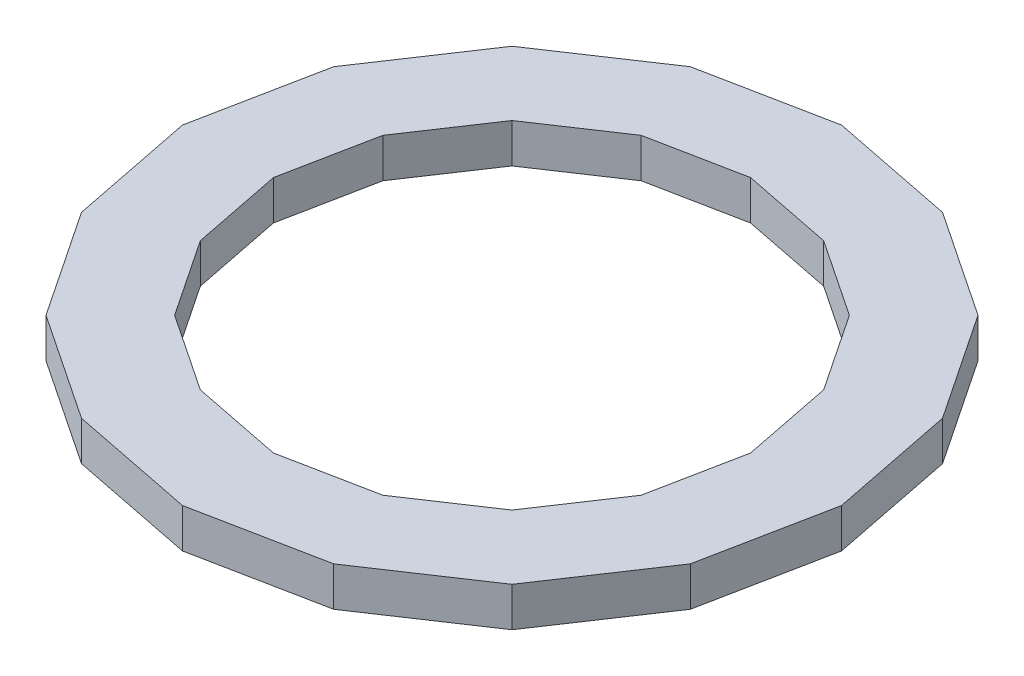
ISO-10303-21;
HEADER;
FILE_DESCRIPTION(('STEP AP214'),'2;1');
FILE_NAME('part.step','',(''),(''),'','','');
FILE_SCHEMA(('AUTOMOTIVE_DESIGN { 1 0 10303 214 1 1 1 1 }'));
ENDSEC;
DATA;
#1=APPLICATION_CONTEXT('core data for automotive mechanical design processes');
#2=APPLICATION_PROTOCOL_DEFINITION('international standard','automotive_design',2000,#1);
#3=PRODUCT_CONTEXT('',#1,'mechanical');
#4=PRODUCT('Part','Part','',(#3));
#5=PRODUCT_RELATED_PRODUCT_CATEGORY('part','',(#4));
#6=PRODUCT_DEFINITION_FORMATION('','',#4);
#7=PRODUCT_DEFINITION_CONTEXT('part definition',#1,'design');
#8=PRODUCT_DEFINITION('design','',#6,#7);
#9=PRODUCT_DEFINITION_SHAPE('','',#8);
#10=(LENGTH_UNIT() NAMED_UNIT(*) SI_UNIT(.MILLI.,.METRE.));
#11=(NAMED_UNIT(*) PLANE_ANGLE_UNIT() SI_UNIT($,.RADIAN.));
#12=(NAMED_UNIT(*) SI_UNIT($,.STERADIAN.) SOLID_ANGLE_UNIT());
#13=UNCERTAINTY_MEASURE_WITH_UNIT(LENGTH_MEASURE(1.E-05),#10,'distance_accuracy_value','');
#14=(GEOMETRIC_REPRESENTATION_CONTEXT(3) GLOBAL_UNCERTAINTY_ASSIGNED_CONTEXT((#13)) GLOBAL_UNIT_ASSIGNED_CONTEXT((#10,
#11,#12)) REPRESENTATION_CONTEXT('',''));
#15=CARTESIAN_POINT('',(0.,0.,0.));
#16=DIRECTION('',(0.,0.,1.));
#17=DIRECTION('',(1.,0.,0.));
#18=AXIS2_PLACEMENT_3D('',#15,#16,#17);
#19=CARTESIAN_POINT('',(0.,19.05,0.));
#20=DIRECTION('',(0.,1.,0.));
#21=DIRECTION('',(0.,0.,1.));
#22=AXIS2_PLACEMENT_3D('',#19,#20,#21);
#23=PLANE('',#22);
#24=DIRECTION('',(0.195090322016117,0.,-0.980785280403233));
#25=VECTOR('',#24,1.);
#26=CARTESIAN_POINT('',(147.349757573891,19.05,61.0342679994913));
#27=LINE('',#26,#25);
#28=CARTESIAN_POINT('',(147.349757573891,19.05,61.0342679994913));
#29=VERTEX_POINT('',#28);
#30=CARTESIAN_POINT('',(159.490228312954,19.05,-1.84921265718118E-12));
#31=VERTEX_POINT('',#30);
#32=EDGE_CURVE('E378',#29,#31,#27,.T.);
#33=ORIENTED_EDGE('',*,*,#32,.T.);
#34=DIRECTION('',(-0.195090322016139,0.,-0.980785280403228));
#35=VECTOR('',#34,1.);
#36=CARTESIAN_POINT('',(159.490228312954,19.05,-1.84921265718118E-12));
#37=LINE('',#36,#35);
#38=CARTESIAN_POINT('',(147.349757573889,19.05,-61.0342679994947));
#39=VERTEX_POINT('',#38);
#40=EDGE_CURVE('E381',#31,#39,#37,.T.);
#41=ORIENTED_EDGE('',*,*,#40,.T.);
#42=DIRECTION('',(-0.555570233019612,0.,-0.831469612302539));
#43=VECTOR('',#42,1.);
#44=CARTESIAN_POINT('',(147.349757573889,19.05,-61.0342679994947));
#45=LINE('',#44,#43);
#46=CARTESIAN_POINT('',(112.776621973079,19.05,-112.776621973082));
#47=VERTEX_POINT('',#46);
#48=EDGE_CURVE('E384',#39,#47,#45,.T.);
#49=ORIENTED_EDGE('',*,*,#48,.T.);
#50=DIRECTION('',(-0.831469612302552,0.,-0.555570233019592));
#51=VECTOR('',#50,1.);
#52=CARTESIAN_POINT('',(112.776621973079,19.05,-112.776621973082));
#53=LINE('',#52,#51);
#54=CARTESIAN_POINT('',(61.0342679994915,19.05,-147.349757573891));
#55=VERTEX_POINT('',#54);
#56=EDGE_CURVE('E386',#47,#55,#53,.T.);
#57=ORIENTED_EDGE('',*,*,#56,.T.);
#58=DIRECTION('',(-0.980785280403233,0.,-0.195090322016117));
#59=VECTOR('',#58,1.);
#60=CARTESIAN_POINT('',(61.0342679994915,19.05,-147.349757573891));
#61=LINE('',#60,#59);
#62=CARTESIAN_POINT('',(-1.93094145436864E-12,19.05,-159.490228312954));
#63=VERTEX_POINT('',#62);
#64=EDGE_CURVE('E388',#55,#63,#61,.T.);
#65=ORIENTED_EDGE('',*,*,#64,.T.);
#66=DIRECTION('',(-0.980785280403228,0.,0.19509032201614));
#67=VECTOR('',#66,1.);
#68=CARTESIAN_POINT('',(-1.93094145436864E-12,19.05,-159.490228312954));
#69=LINE('',#68,#67);
#70=CARTESIAN_POINT('',(-61.0342679994947,19.05,-147.349757573889));
#71=VERTEX_POINT('',#70);
#72=EDGE_CURVE('E390',#63,#71,#69,.T.);
#73=ORIENTED_EDGE('',*,*,#72,.T.);
#74=DIRECTION('',(-0.831469612302539,0.,0.555570233019612));
#75=VECTOR('',#74,1.);
#76=CARTESIAN_POINT('',(-61.0342679994947,19.05,-147.349757573889));
#77=LINE('',#76,#75);
#78=CARTESIAN_POINT('',(-112.776621973082,19.05,-112.776621973079));
#79=VERTEX_POINT('',#78);
#80=EDGE_CURVE('E392',#71,#79,#77,.T.);
#81=ORIENTED_EDGE('',*,*,#80,.T.);
#82=DIRECTION('',(-0.555570233019593,0.,0.831469612302552));
#83=VECTOR('',#82,1.);
#84=CARTESIAN_POINT('',(-112.776621973082,19.05,-112.776621973079));
#85=LINE('',#84,#83);
#86=CARTESIAN_POINT('',(-147.349757573891,19.05,-61.0342679994913));
#87=VERTEX_POINT('',#86);
#88=EDGE_CURVE('E394',#79,#87,#85,.T.);
#89=ORIENTED_EDGE('',*,*,#88,.T.);
#90=DIRECTION('',(-0.195090322016117,0.,0.980785280403233));
#91=VECTOR('',#90,1.);
#92=CARTESIAN_POINT('',(-147.349757573891,19.05,-61.0342679994913));
#93=LINE('',#92,#91);
#94=CARTESIAN_POINT('',(-159.490228312954,19.05,1.84609156139237E-12));
#95=VERTEX_POINT('',#94);
#96=EDGE_CURVE('E397',#87,#95,#93,.T.);
#97=ORIENTED_EDGE('',*,*,#96,.T.);
#98=DIRECTION('',(0.195090322016139,0.,0.980785280403228));
#99=VECTOR('',#98,1.);
#100=CARTESIAN_POINT('',(-159.490228312954,19.05,1.84609156139237E-12));
#101=LINE('',#100,#99);
#102=CARTESIAN_POINT('',(-147.349757573889,19.05,61.0342679994947));
#103=VERTEX_POINT('',#102);
#104=EDGE_CURVE('E399',#95,#103,#101,.T.);
#105=ORIENTED_EDGE('',*,*,#104,.T.);
#106=DIRECTION('',(0.555570233019612,0.,0.831469612302539));
#107=VECTOR('',#106,1.);
#108=CARTESIAN_POINT('',(-147.349757573889,19.05,61.0342679994947));
#109=LINE('',#108,#107);
#110=CARTESIAN_POINT('',(-112.776621973079,19.05,112.776621973082));
#111=VERTEX_POINT('',#110);
#112=EDGE_CURVE('E401',#103,#111,#109,.T.);
#113=ORIENTED_EDGE('',*,*,#112,.T.);
#114=DIRECTION('',(0.831469612302551,0.,0.555570233019593));
#115=VECTOR('',#114,1.);
#116=CARTESIAN_POINT('',(-112.776621973079,19.05,112.776621973082));
#117=LINE('',#116,#115);
#118=CARTESIAN_POINT('',(-61.0342679994913,19.05,147.349757573891));
#119=VERTEX_POINT('',#118);
#120=EDGE_CURVE('E404',#111,#119,#117,.T.);
#121=ORIENTED_EDGE('',*,*,#120,.T.);
#122=DIRECTION('',(0.980785280403233,0.,0.195090322016117));
#123=VECTOR('',#122,1.);
#124=CARTESIAN_POINT('',(-61.0342679994913,19.05,147.349757573891));
#125=LINE('',#124,#123);
#126=CARTESIAN_POINT('',(1.78007314182968E-12,19.05,159.490228312954));
#127=VERTEX_POINT('',#126);
#128=EDGE_CURVE('E407',#119,#127,#125,.T.);
#129=ORIENTED_EDGE('',*,*,#128,.T.);
#130=DIRECTION('',(0.980785280403228,0.,-0.195090322016139));
#131=VECTOR('',#130,1.);
#132=CARTESIAN_POINT('',(1.78007314182968E-12,19.05,159.490228312954));
#133=LINE('',#132,#131);
#134=CARTESIAN_POINT('',(61.0342679994947,19.05,147.349757573889));
#135=VERTEX_POINT('',#134);
#136=EDGE_CURVE('E409',#127,#135,#133,.T.);
#137=ORIENTED_EDGE('',*,*,#136,.T.);
#138=DIRECTION('',(0.831469612302539,0.,-0.555570233019612));
#139=VECTOR('',#138,1.);
#140=CARTESIAN_POINT('',(61.0342679994947,19.05,147.349757573889));
#141=LINE('',#140,#139);
#142=CARTESIAN_POINT('',(112.776621973082,19.05,112.776621973079));
#143=VERTEX_POINT('',#142);
#144=EDGE_CURVE('E412',#135,#143,#141,.T.);
#145=ORIENTED_EDGE('',*,*,#144,.T.);
#146=DIRECTION('',(0.555570233019593,0.,-0.831469612302552));
#147=VECTOR('',#146,1.);
#148=CARTESIAN_POINT('',(112.776621973082,19.05,112.776621973079));
#149=LINE('',#148,#147);
#150=EDGE_CURVE('E415',#143,#29,#149,.T.);
#151=ORIENTED_EDGE('',*,*,#150,.T.);
#152=EDGE_LOOP('',(#33,#41,#49,#57,#65,#73,#81,#89,#97,#105,#113,#121,#129,#137,#145,#151));
#153=FACE_BOUND('',#152,.T.);
#154=DIRECTION('',(-0.19509032201614,0.,-0.980785280403228));
#155=VECTOR('',#154,1.);
#156=CARTESIAN_POINT('',(115.464282101519,19.05,-1.37402825448511E-12));
#157=LINE('',#156,#155);
#158=CARTESIAN_POINT('',(115.464282101519,19.05,-1.37402825448511E-12));
#159=VERTEX_POINT('',#158);
#160=CARTESIAN_POINT('',(106.675086969702,19.05,-44.1862677901814));
#161=VERTEX_POINT('',#160);
#162=EDGE_CURVE('E252',#159,#161,#157,.T.);
#163=ORIENTED_EDGE('',*,*,#162,.F.);
#164=DIRECTION('',(0.195090322016117,0.,-0.980785280403233));
#165=VECTOR('',#164,1.);
#166=CARTESIAN_POINT('',(106.675086969703,19.05,44.1862677901788));
#167=LINE('',#166,#165);
#168=CARTESIAN_POINT('',(106.675086969703,19.05,44.1862677901788));
#169=VERTEX_POINT('',#168);
#170=EDGE_CURVE('E243',#169,#159,#167,.T.);
#171=ORIENTED_EDGE('',*,*,#170,.F.);
#172=DIRECTION('',(0.555570233019592,0.,-0.831469612302552));
#173=VECTOR('',#172,1.);
#174=CARTESIAN_POINT('',(81.6455768588213,19.05,81.6455768588193));
#175=LINE('',#174,#173);
#176=CARTESIAN_POINT('',(81.6455768588213,19.05,81.6455768588193));
#177=VERTEX_POINT('',#176);
#178=EDGE_CURVE('E296',#177,#169,#175,.T.);
#179=ORIENTED_EDGE('',*,*,#178,.F.);
#180=DIRECTION('',(0.831469612302538,0.,-0.555570233019612));
#181=VECTOR('',#180,1.);
#182=CARTESIAN_POINT('',(44.1862677901814,19.05,106.675086969702));
#183=LINE('',#182,#181);
#184=CARTESIAN_POINT('',(44.1862677901814,19.05,106.675086969702));
#185=VERTEX_POINT('',#184);
#186=EDGE_CURVE('E294',#185,#177,#183,.T.);
#187=ORIENTED_EDGE('',*,*,#186,.F.);
#188=DIRECTION('',(0.980785280403228,0.,-0.19509032201614));
#189=VECTOR('',#188,1.);
#190=CARTESIAN_POINT('',(1.33926693915157E-12,19.05,115.464282101519));
#191=LINE('',#190,#189);
#192=CARTESIAN_POINT('',(1.33926693915157E-12,19.05,115.464282101519));
#193=VERTEX_POINT('',#192);
#194=EDGE_CURVE('E292',#193,#185,#191,.T.);
#195=ORIENTED_EDGE('',*,*,#194,.F.);
#196=DIRECTION('',(0.980785280403233,0.,0.195090322016116));
#197=VECTOR('',#196,1.);
#198=CARTESIAN_POINT('',(-44.1862677901788,19.05,106.675086969703));
#199=LINE('',#198,#197);
#200=CARTESIAN_POINT('',(-44.1862677901788,19.05,106.675086969703));
#201=VERTEX_POINT('',#200);
#202=EDGE_CURVE('E290',#201,#193,#199,.T.);
#203=ORIENTED_EDGE('',*,*,#202,.F.);
#204=DIRECTION('',(0.831469612302552,0.,0.555570233019592));
#205=VECTOR('',#204,1.);
#206=CARTESIAN_POINT('',(-81.6455768588193,19.05,81.6455768588213));
#207=LINE('',#206,#205);
#208=CARTESIAN_POINT('',(-81.6455768588193,19.05,81.6455768588213));
#209=VERTEX_POINT('',#208);
#210=EDGE_CURVE('E288',#209,#201,#207,.T.);
#211=ORIENTED_EDGE('',*,*,#210,.F.);
#212=DIRECTION('',(0.555570233019612,0.,0.831469612302539));
#213=VECTOR('',#212,1.);
#214=CARTESIAN_POINT('',(-106.675086969702,19.05,44.1862677901815));
#215=LINE('',#214,#213);
#216=CARTESIAN_POINT('',(-106.675086969702,19.05,44.1862677901815));
#217=VERTEX_POINT('',#216);
#218=EDGE_CURVE('E285',#217,#209,#215,.T.);
#219=ORIENTED_EDGE('',*,*,#218,.F.);
#220=DIRECTION('',(0.19509032201614,0.,0.980785280403228));
#221=VECTOR('',#220,1.);
#222=CARTESIAN_POINT('',(-115.464282101519,19.05,1.38800018994925E-12));
#223=LINE('',#222,#221);
#224=CARTESIAN_POINT('',(-115.464282101519,19.05,1.38800018994925E-12));
#225=VERTEX_POINT('',#224);
#226=EDGE_CURVE('E283',#225,#217,#223,.T.);
#227=ORIENTED_EDGE('',*,*,#226,.F.);
#228=DIRECTION('',(-0.195090322016117,0.,0.980785280403233));
#229=VECTOR('',#228,1.);
#230=CARTESIAN_POINT('',(-106.675086969703,19.05,-44.1862677901788));
#231=LINE('',#230,#229);
#232=CARTESIAN_POINT('',(-106.675086969703,19.05,-44.1862677901788));
#233=VERTEX_POINT('',#232);
#234=EDGE_CURVE('E280',#233,#225,#231,.T.);
#235=ORIENTED_EDGE('',*,*,#234,.F.);
#236=DIRECTION('',(-0.555570233019592,0.,0.831469612302552));
#237=VECTOR('',#236,1.);
#238=CARTESIAN_POINT('',(-81.6455768588213,19.05,-81.6455768588193));
#239=LINE('',#238,#237);
#240=CARTESIAN_POINT('',(-81.6455768588213,19.05,-81.6455768588193));
#241=VERTEX_POINT('',#240);
#242=EDGE_CURVE('E277',#241,#233,#239,.T.);
#243=ORIENTED_EDGE('',*,*,#242,.F.);
#244=DIRECTION('',(-0.831469612302539,0.,0.555570233019612));
#245=VECTOR('',#244,1.);
#246=CARTESIAN_POINT('',(-44.1862677901814,19.05,-106.675086969702));
#247=LINE('',#246,#245);
#248=CARTESIAN_POINT('',(-44.1862677901814,19.05,-106.675086969702));
#249=VERTEX_POINT('',#248);
#250=EDGE_CURVE('E275',#249,#241,#247,.T.);
#251=ORIENTED_EDGE('',*,*,#250,.F.);
#252=DIRECTION('',(-0.980785280403228,0.,0.19509032201614));
#253=VECTOR('',#252,1.);
#254=CARTESIAN_POINT('',(-1.4291549179459E-12,19.05,-115.464282101519));
#255=LINE('',#254,#253);
#256=CARTESIAN_POINT('',(-1.4291549179459E-12,19.05,-115.464282101519));
#257=VERTEX_POINT('',#256);
#258=EDGE_CURVE('E273',#257,#249,#255,.T.);
#259=ORIENTED_EDGE('',*,*,#258,.F.);
#260=DIRECTION('',(-0.980785280403233,0.,-0.195090322016116));
#261=VECTOR('',#260,1.);
#262=CARTESIAN_POINT('',(44.1862677901789,19.05,-106.675086969703));
#263=LINE('',#262,#261);
#264=CARTESIAN_POINT('',(44.1862677901789,19.05,-106.675086969703));
#265=VERTEX_POINT('',#264);
#266=EDGE_CURVE('E271',#265,#257,#263,.T.);
#267=ORIENTED_EDGE('',*,*,#266,.F.);
#268=DIRECTION('',(-0.831469612302552,0.,-0.555570233019592));
#269=VECTOR('',#268,1.);
#270=CARTESIAN_POINT('',(81.6455768588193,19.05,-81.6455768588213));
#271=LINE('',#270,#269);
#272=CARTESIAN_POINT('',(81.6455768588193,19.05,-81.6455768588213));
#273=VERTEX_POINT('',#272);
#274=EDGE_CURVE('E267',#273,#265,#271,.T.);
#275=ORIENTED_EDGE('',*,*,#274,.F.);
#276=DIRECTION('',(-0.555570233019612,0.,-0.831469612302538));
#277=VECTOR('',#276,1.);
#278=CARTESIAN_POINT('',(106.675086969702,19.05,-44.1862677901814));
#279=LINE('',#278,#277);
#280=EDGE_CURVE('E265',#161,#273,#279,.T.);
#281=ORIENTED_EDGE('',*,*,#280,.F.);
#282=EDGE_LOOP('',(#163,#171,#179,#187,#195,#203,#211,#219,#227,#235,#243,#251,#259,#267,#275,#281));
#283=FACE_BOUND('',#282,.T.);
#284=ADVANCED_FACE('F34',(#153,#283),#23,.T.);
#285=CARTESIAN_POINT('',(0.,0.,0.));
#286=DIRECTION('',(0.,1.,0.));
#287=DIRECTION('',(0.,0.,1.));
#288=AXIS2_PLACEMENT_3D('',#285,#286,#287);
#289=PLANE('',#288);
#290=DIRECTION('',(0.195090322016117,0.,-0.980785280403233));
#291=VECTOR('',#290,1.);
#292=CARTESIAN_POINT('',(147.349757573891,0.,61.0342679994913));
#293=LINE('',#292,#291);
#294=CARTESIAN_POINT('',(147.349757573891,0.,61.0342679994913));
#295=VERTEX_POINT('',#294);
#296=CARTESIAN_POINT('',(159.490228312954,0.,-1.84921265718118E-12));
#297=VERTEX_POINT('',#296);
#298=EDGE_CURVE('E260',#295,#297,#293,.T.);
#299=ORIENTED_EDGE('',*,*,#298,.F.);
#300=DIRECTION('',(0.555570233019593,0.,-0.831469612302552));
#301=VECTOR('',#300,1.);
#302=CARTESIAN_POINT('',(112.776621973082,0.,112.776621973079));
#303=LINE('',#302,#301);
#304=CARTESIAN_POINT('',(112.776621973082,0.,112.776621973079));
#305=VERTEX_POINT('',#304);
#306=EDGE_CURVE('E382',#305,#295,#303,.T.);
#307=ORIENTED_EDGE('',*,*,#306,.F.);
#308=DIRECTION('',(0.831469612302539,0.,-0.555570233019612));
#309=VECTOR('',#308,1.);
#310=CARTESIAN_POINT('',(61.0342679994947,0.,147.349757573889));
#311=LINE('',#310,#309);
#312=CARTESIAN_POINT('',(61.0342679994947,0.,147.349757573889));
#313=VERTEX_POINT('',#312);
#314=EDGE_CURVE('E450',#313,#305,#311,.T.);
#315=ORIENTED_EDGE('',*,*,#314,.F.);
#316=DIRECTION('',(0.980785280403228,0.,-0.195090322016139));
#317=VECTOR('',#316,1.);
#318=CARTESIAN_POINT('',(1.78007314182968E-12,0.,159.490228312954));
#319=LINE('',#318,#317);
#320=CARTESIAN_POINT('',(1.78007314182968E-12,0.,159.490228312954));
#321=VERTEX_POINT('',#320);
#322=EDGE_CURVE('E447',#321,#313,#319,.T.);
#323=ORIENTED_EDGE('',*,*,#322,.F.);
#324=DIRECTION('',(0.980785280403233,0.,0.195090322016117));
#325=VECTOR('',#324,1.);
#326=CARTESIAN_POINT('',(-61.0342679994913,0.,147.349757573891));
#327=LINE('',#326,#325);
#328=CARTESIAN_POINT('',(-61.0342679994913,0.,147.349757573891));
#329=VERTEX_POINT('',#328);
#330=EDGE_CURVE('E444',#329,#321,#327,.T.);
#331=ORIENTED_EDGE('',*,*,#330,.F.);
#332=DIRECTION('',(0.831469612302551,0.,0.555570233019593));
#333=VECTOR('',#332,1.);
#334=CARTESIAN_POINT('',(-112.776621973079,0.,112.776621973082));
#335=LINE('',#334,#333);
#336=CARTESIAN_POINT('',(-112.776621973079,0.,112.776621973082));
#337=VERTEX_POINT('',#336);
#338=EDGE_CURVE('E441',#337,#329,#335,.T.);
#339=ORIENTED_EDGE('',*,*,#338,.F.);
#340=DIRECTION('',(0.555570233019612,0.,0.831469612302539));
#341=VECTOR('',#340,1.);
#342=CARTESIAN_POINT('',(-147.349757573889,0.,61.0342679994947));
#343=LINE('',#342,#341);
#344=CARTESIAN_POINT('',(-147.349757573889,0.,61.0342679994947));
#345=VERTEX_POINT('',#344);
#346=EDGE_CURVE('E439',#345,#337,#343,.T.);
#347=ORIENTED_EDGE('',*,*,#346,.F.);
#348=DIRECTION('',(0.195090322016139,0.,0.980785280403228));
#349=VECTOR('',#348,1.);
#350=CARTESIAN_POINT('',(-159.490228312954,0.,1.84609156139237E-12));
#351=LINE('',#350,#349);
#352=CARTESIAN_POINT('',(-159.490228312954,0.,1.84609156139237E-12));
#353=VERTEX_POINT('',#352);
#354=EDGE_CURVE('E436',#353,#345,#351,.T.);
#355=ORIENTED_EDGE('',*,*,#354,.F.);
#356=DIRECTION('',(-0.195090322016117,0.,0.980785280403233));
#357=VECTOR('',#356,1.);
#358=CARTESIAN_POINT('',(-147.349757573891,0.,-61.0342679994913));
#359=LINE('',#358,#357);
#360=CARTESIAN_POINT('',(-147.349757573891,0.,-61.0342679994913));
#361=VERTEX_POINT('',#360);
#362=EDGE_CURVE('E434',#361,#353,#359,.T.);
#363=ORIENTED_EDGE('',*,*,#362,.F.);
#364=DIRECTION('',(-0.555570233019593,0.,0.831469612302552));
#365=VECTOR('',#364,1.);
#366=CARTESIAN_POINT('',(-112.776621973082,0.,-112.776621973079));
#367=LINE('',#366,#365);
#368=CARTESIAN_POINT('',(-112.776621973082,0.,-112.776621973079));
#369=VERTEX_POINT('',#368);
#370=EDGE_CURVE('E432',#369,#361,#367,.T.);
#371=ORIENTED_EDGE('',*,*,#370,.F.);
#372=DIRECTION('',(-0.831469612302539,0.,0.555570233019612));
#373=VECTOR('',#372,1.);
#374=CARTESIAN_POINT('',(-61.0342679994947,0.,-147.349757573889));
#375=LINE('',#374,#373);
#376=CARTESIAN_POINT('',(-61.0342679994947,0.,-147.349757573889));
#377=VERTEX_POINT('',#376);
#378=EDGE_CURVE('E430',#377,#369,#375,.T.);
#379=ORIENTED_EDGE('',*,*,#378,.F.);
#380=DIRECTION('',(-0.980785280403228,0.,0.19509032201614));
#381=VECTOR('',#380,1.);
#382=CARTESIAN_POINT('',(-1.93094145436864E-12,0.,-159.490228312954));
#383=LINE('',#382,#381);
#384=CARTESIAN_POINT('',(-1.93094145436864E-12,0.,-159.490228312954));
#385=VERTEX_POINT('',#384);
#386=EDGE_CURVE('E428',#385,#377,#383,.T.);
#387=ORIENTED_EDGE('',*,*,#386,.F.);
#388=DIRECTION('',(-0.980785280403233,0.,-0.195090322016117));
#389=VECTOR('',#388,1.);
#390=CARTESIAN_POINT('',(61.0342679994915,0.,-147.349757573891));
#391=LINE('',#390,#389);
#392=CARTESIAN_POINT('',(61.0342679994915,0.,-147.349757573891));
#393=VERTEX_POINT('',#392);
#394=EDGE_CURVE('E426',#393,#385,#391,.T.);
#395=ORIENTED_EDGE('',*,*,#394,.F.);
#396=DIRECTION('',(-0.831469612302552,0.,-0.555570233019592));
#397=VECTOR('',#396,1.);
#398=CARTESIAN_POINT('',(112.776621973079,0.,-112.776621973082));
#399=LINE('',#398,#397);
#400=CARTESIAN_POINT('',(112.776621973079,0.,-112.776621973082));
#401=VERTEX_POINT('',#400);
#402=EDGE_CURVE('E424',#401,#393,#399,.T.);
#403=ORIENTED_EDGE('',*,*,#402,.F.);
#404=DIRECTION('',(-0.555570233019612,0.,-0.831469612302539));
#405=VECTOR('',#404,1.);
#406=CARTESIAN_POINT('',(147.349757573889,0.,-61.0342679994947));
#407=LINE('',#406,#405);
#408=CARTESIAN_POINT('',(147.349757573889,0.,-61.0342679994947));
#409=VERTEX_POINT('',#408);
#410=EDGE_CURVE('E422',#409,#401,#407,.T.);
#411=ORIENTED_EDGE('',*,*,#410,.F.);
#412=DIRECTION('',(-0.195090322016139,0.,-0.980785280403228));
#413=VECTOR('',#412,1.);
#414=CARTESIAN_POINT('',(159.490228312954,0.,-1.84921265718118E-12));
#415=LINE('',#414,#413);
#416=EDGE_CURVE('E420',#297,#409,#415,.T.);
#417=ORIENTED_EDGE('',*,*,#416,.F.);
#418=EDGE_LOOP('',(#299,#307,#315,#323,#331,#339,#347,#355,#363,#371,#379,#387,#395,#403,#411,#417));
#419=FACE_BOUND('',#418,.T.);
#420=DIRECTION('',(0.195090322016117,0.,-0.980785280403233));
#421=VECTOR('',#420,1.);
#422=CARTESIAN_POINT('',(106.675086969703,0.,44.1862677901788));
#423=LINE('',#422,#421);
#424=CARTESIAN_POINT('',(106.675086969703,0.,44.1862677901788));
#425=VERTEX_POINT('',#424);
#426=CARTESIAN_POINT('',(115.464282101519,0.,-1.37402825448511E-12));
#427=VERTEX_POINT('',#426);
#428=EDGE_CURVE('E57',#425,#427,#423,.T.);
#429=ORIENTED_EDGE('',*,*,#428,.T.);
#430=DIRECTION('',(-0.19509032201614,0.,-0.980785280403228));
#431=VECTOR('',#430,1.);
#432=CARTESIAN_POINT('',(115.464282101519,0.,-1.37402825448511E-12));
#433=LINE('',#432,#431);
#434=CARTESIAN_POINT('',(106.675086969702,0.,-44.1862677901814));
#435=VERTEX_POINT('',#434);
#436=EDGE_CURVE('E259',#427,#435,#433,.T.);
#437=ORIENTED_EDGE('',*,*,#436,.T.);
#438=DIRECTION('',(-0.555570233019612,0.,-0.831469612302538));
#439=VECTOR('',#438,1.);
#440=CARTESIAN_POINT('',(106.675086969702,0.,-44.1862677901814));
#441=LINE('',#440,#439);
#442=CARTESIAN_POINT('',(81.6455768588193,0.,-81.6455768588213));
#443=VERTEX_POINT('',#442);
#444=EDGE_CURVE('E300',#435,#443,#441,.T.);
#445=ORIENTED_EDGE('',*,*,#444,.T.);
#446=DIRECTION('',(-0.831469612302552,0.,-0.555570233019592));
#447=VECTOR('',#446,1.);
#448=CARTESIAN_POINT('',(81.6455768588193,0.,-81.6455768588213));
#449=LINE('',#448,#447);
#450=CARTESIAN_POINT('',(44.1862677901789,0.,-106.675086969703));
#451=VERTEX_POINT('',#450);
#452=EDGE_CURVE('E303',#443,#451,#449,.T.);
#453=ORIENTED_EDGE('',*,*,#452,.T.);
#454=DIRECTION('',(-0.980785280403233,0.,-0.195090322016116));
#455=VECTOR('',#454,1.);
#456=CARTESIAN_POINT('',(44.1862677901789,0.,-106.675086969703));
#457=LINE('',#456,#455);
#458=CARTESIAN_POINT('',(-1.4291549179459E-12,0.,-115.464282101519));
#459=VERTEX_POINT('',#458);
#460=EDGE_CURVE('E306',#451,#459,#457,.T.);
#461=ORIENTED_EDGE('',*,*,#460,.T.);
#462=DIRECTION('',(-0.980785280403228,0.,0.19509032201614));
#463=VECTOR('',#462,1.);
#464=CARTESIAN_POINT('',(-1.4291549179459E-12,0.,-115.464282101519));
#465=LINE('',#464,#463);
#466=CARTESIAN_POINT('',(-44.1862677901814,0.,-106.675086969702));
#467=VERTEX_POINT('',#466);
#468=EDGE_CURVE('E310',#459,#467,#465,.T.);
#469=ORIENTED_EDGE('',*,*,#468,.T.);
#470=DIRECTION('',(-0.831469612302539,0.,0.555570233019612));
#471=VECTOR('',#470,1.);
#472=CARTESIAN_POINT('',(-44.1862677901814,0.,-106.675086969702));
#473=LINE('',#472,#471);
#474=CARTESIAN_POINT('',(-81.6455768588213,0.,-81.6455768588193));
#475=VERTEX_POINT('',#474);
#476=EDGE_CURVE('E313',#467,#475,#473,.T.);
#477=ORIENTED_EDGE('',*,*,#476,.T.);
#478=DIRECTION('',(-0.555570233019592,0.,0.831469612302552));
#479=VECTOR('',#478,1.);
#480=CARTESIAN_POINT('',(-81.6455768588213,0.,-81.6455768588193));
#481=LINE('',#480,#479);
#482=CARTESIAN_POINT('',(-106.675086969703,0.,-44.1862677901788));
#483=VERTEX_POINT('',#482);
#484=EDGE_CURVE('E317',#475,#483,#481,.T.);
#485=ORIENTED_EDGE('',*,*,#484,.T.);
#486=DIRECTION('',(-0.195090322016117,0.,0.980785280403233));
#487=VECTOR('',#486,1.);
#488=CARTESIAN_POINT('',(-106.675086969703,0.,-44.1862677901788));
#489=LINE('',#488,#487);
#490=CARTESIAN_POINT('',(-115.464282101519,0.,1.38800018994925E-12));
#491=VERTEX_POINT('',#490);
#492=EDGE_CURVE('E320',#483,#491,#489,.T.);
#493=ORIENTED_EDGE('',*,*,#492,.T.);
#494=DIRECTION('',(0.19509032201614,0.,0.980785280403228));
#495=VECTOR('',#494,1.);
#496=CARTESIAN_POINT('',(-115.464282101519,0.,1.38800018994925E-12));
#497=LINE('',#496,#495);
#498=CARTESIAN_POINT('',(-106.675086969702,0.,44.1862677901815));
#499=VERTEX_POINT('',#498);
#500=EDGE_CURVE('E324',#491,#499,#497,.T.);
#501=ORIENTED_EDGE('',*,*,#500,.T.);
#502=DIRECTION('',(0.555570233019612,0.,0.831469612302539));
#503=VECTOR('',#502,1.);
#504=CARTESIAN_POINT('',(-106.675086969702,0.,44.1862677901815));
#505=LINE('',#504,#503);
#506=CARTESIAN_POINT('',(-81.6455768588193,0.,81.6455768588213));
#507=VERTEX_POINT('',#506);
#508=EDGE_CURVE('E327',#499,#507,#505,.T.);
#509=ORIENTED_EDGE('',*,*,#508,.T.);
#510=DIRECTION('',(0.831469612302552,0.,0.555570233019592));
#511=VECTOR('',#510,1.);
#512=CARTESIAN_POINT('',(-81.6455768588193,0.,81.6455768588213));
#513=LINE('',#512,#511);
#514=CARTESIAN_POINT('',(-44.1862677901788,0.,106.675086969703));
#515=VERTEX_POINT('',#514);
#516=EDGE_CURVE('E330',#507,#515,#513,.T.);
#517=ORIENTED_EDGE('',*,*,#516,.T.);
#518=DIRECTION('',(0.980785280403233,0.,0.195090322016116));
#519=VECTOR('',#518,1.);
#520=CARTESIAN_POINT('',(-44.1862677901788,0.,106.675086969703));
#521=LINE('',#520,#519);
#522=CARTESIAN_POINT('',(1.33926693915157E-12,0.,115.464282101519));
#523=VERTEX_POINT('',#522);
#524=EDGE_CURVE('E334',#515,#523,#521,.T.);
#525=ORIENTED_EDGE('',*,*,#524,.T.);
#526=DIRECTION('',(0.980785280403228,0.,-0.19509032201614));
#527=VECTOR('',#526,1.);
#528=CARTESIAN_POINT('',(1.33926693915157E-12,0.,115.464282101519));
#529=LINE('',#528,#527);
#530=CARTESIAN_POINT('',(44.1862677901814,0.,106.675086969702));
#531=VERTEX_POINT('',#530);
#532=EDGE_CURVE('E337',#523,#531,#529,.T.);
#533=ORIENTED_EDGE('',*,*,#532,.T.);
#534=DIRECTION('',(0.831469612302538,0.,-0.555570233019612));
#535=VECTOR('',#534,1.);
#536=CARTESIAN_POINT('',(44.1862677901814,0.,106.675086969702));
#537=LINE('',#536,#535);
#538=CARTESIAN_POINT('',(81.6455768588213,0.,81.6455768588193));
#539=VERTEX_POINT('',#538);
#540=EDGE_CURVE('E341',#531,#539,#537,.T.);
#541=ORIENTED_EDGE('',*,*,#540,.T.);
#542=DIRECTION('',(0.555570233019592,0.,-0.831469612302552));
#543=VECTOR('',#542,1.);
#544=CARTESIAN_POINT('',(81.6455768588213,0.,81.6455768588193));
#545=LINE('',#544,#543);
#546=EDGE_CURVE('E253',#539,#425,#545,.T.);
#547=ORIENTED_EDGE('',*,*,#546,.T.);
#548=EDGE_LOOP('',(#429,#437,#445,#453,#461,#469,#477,#485,#493,#501,#509,#517,#525,#533,#541,#547));
#549=FACE_BOUND('',#548,.T.);
#550=ADVANCED_FACE('F509',(#419,#549),#289,.F.);
#551=CARTESIAN_POINT('',(147.349757573891,19.05,61.0342679994913));
#552=DIRECTION('',(-0.980785280403233,0.,-0.195090322016117));
#553=DIRECTION('',(-0.195090322016117,0.,0.980785280403233));
#554=AXIS2_PLACEMENT_3D('',#551,#552,#553);
#555=PLANE('',#554);
#556=ORIENTED_EDGE('',*,*,#298,.T.);
#557=DIRECTION('',(0.,-1.,0.));
#558=VECTOR('',#557,1.);
#559=CARTESIAN_POINT('',(159.490228312954,19.05,-1.84921265718118E-12));
#560=LINE('',#559,#558);
#561=EDGE_CURVE('E11',#31,#297,#560,.T.);
#562=ORIENTED_EDGE('',*,*,#561,.F.);
#563=ORIENTED_EDGE('',*,*,#32,.F.);
#564=DIRECTION('',(0.,-1.,0.));
#565=VECTOR('',#564,1.);
#566=CARTESIAN_POINT('',(147.349757573891,19.05,61.0342679994913));
#567=LINE('',#566,#565);
#568=EDGE_CURVE('E417',#29,#295,#567,.T.);
#569=ORIENTED_EDGE('',*,*,#568,.T.);
#570=EDGE_LOOP('',(#556,#562,#563,#569));
#571=FACE_BOUND('',#570,.T.);
#572=ADVANCED_FACE('F36',(#571),#555,.F.);
#573=CARTESIAN_POINT('',(159.490228312954,19.05,-1.84921265718118E-12));
#574=DIRECTION('',(-0.980785280403228,0.,0.195090322016139));
#575=DIRECTION('',(0.195090322016139,0.,0.980785280403228));
#576=AXIS2_PLACEMENT_3D('',#573,#574,#575);
#577=PLANE('',#576);
#578=ORIENTED_EDGE('',*,*,#416,.T.);
#579=DIRECTION('',(0.,-1.,0.));
#580=VECTOR('',#579,1.);
#581=CARTESIAN_POINT('',(147.349757573889,19.05,-61.0342679994947));
#582=LINE('',#581,#580);
#583=EDGE_CURVE('E42',#39,#409,#582,.T.);
#584=ORIENTED_EDGE('',*,*,#583,.F.);
#585=ORIENTED_EDGE('',*,*,#40,.F.);
#586=ORIENTED_EDGE('',*,*,#561,.T.);
#587=EDGE_LOOP('',(#578,#584,#585,#586));
#588=FACE_BOUND('',#587,.T.);
#589=ADVANCED_FACE('F526',(#588),#577,.F.);
#590=CARTESIAN_POINT('',(147.349757573889,19.05,-61.0342679994947));
#591=DIRECTION('',(-0.831469612302539,0.,0.555570233019612));
#592=DIRECTION('',(0.555570233019612,0.,0.831469612302539));
#593=AXIS2_PLACEMENT_3D('',#590,#591,#592);
#594=PLANE('',#593);
#595=ORIENTED_EDGE('',*,*,#410,.T.);
#596=DIRECTION('',(0.,-1.,0.));
#597=VECTOR('',#596,1.);
#598=CARTESIAN_POINT('',(112.776621973079,19.05,-112.776621973082));
#599=LINE('',#598,#597);
#600=EDGE_CURVE('E496',#47,#401,#599,.T.);
#601=ORIENTED_EDGE('',*,*,#600,.F.);
#602=ORIENTED_EDGE('',*,*,#48,.F.);
#603=ORIENTED_EDGE('',*,*,#583,.T.);
#604=EDGE_LOOP('',(#595,#601,#602,#603));
#605=FACE_BOUND('',#604,.T.);
#606=ADVANCED_FACE('F503',(#605),#594,.F.);
#607=CARTESIAN_POINT('',(112.776621973079,19.05,-112.776621973082));
#608=DIRECTION('',(-0.555570233019593,0.,0.831469612302552));
#609=DIRECTION('',(0.831469612302552,0.,0.555570233019593));
#610=AXIS2_PLACEMENT_3D('',#607,#608,#609);
#611=PLANE('',#610);
#612=ORIENTED_EDGE('',*,*,#402,.T.);
#613=DIRECTION('',(0.,-1.,0.));
#614=VECTOR('',#613,1.);
#615=CARTESIAN_POINT('',(61.0342679994915,19.05,-147.349757573891));
#616=LINE('',#615,#614);
#617=EDGE_CURVE('E492',#55,#393,#616,.T.);
#618=ORIENTED_EDGE('',*,*,#617,.F.);
#619=ORIENTED_EDGE('',*,*,#56,.F.);
#620=ORIENTED_EDGE('',*,*,#600,.T.);
#621=EDGE_LOOP('',(#612,#618,#619,#620));
#622=FACE_BOUND('',#621,.T.);
#623=ADVANCED_FACE('F515',(#622),#611,.F.);
#624=CARTESIAN_POINT('',(61.0342679994915,19.05,-147.349757573891));
#625=DIRECTION('',(-0.195090322016117,0.,0.980785280403233));
#626=DIRECTION('',(0.980785280403233,0.,0.195090322016117));
#627=AXIS2_PLACEMENT_3D('',#624,#625,#626);
#628=PLANE('',#627);
#629=ORIENTED_EDGE('',*,*,#394,.T.);
#630=DIRECTION('',(0.,-1.,0.));
#631=VECTOR('',#630,1.);
#632=CARTESIAN_POINT('',(-1.93094145436864E-12,19.05,-159.490228312954));
#633=LINE('',#632,#631);
#634=EDGE_CURVE('E488',#63,#385,#633,.T.);
#635=ORIENTED_EDGE('',*,*,#634,.F.);
#636=ORIENTED_EDGE('',*,*,#64,.F.);
#637=ORIENTED_EDGE('',*,*,#617,.T.);
#638=EDGE_LOOP('',(#629,#635,#636,#637));
#639=FACE_BOUND('',#638,.T.);
#640=ADVANCED_FACE('F519',(#639),#628,.F.);
#641=CARTESIAN_POINT('',(-1.93094145436864E-12,19.05,-159.490228312954));
#642=DIRECTION('',(0.19509032201614,0.,0.980785280403228));
#643=DIRECTION('',(0.980785280403228,0.,-0.19509032201614));
#644=AXIS2_PLACEMENT_3D('',#641,#642,#643);
#645=PLANE('',#644);
#646=ORIENTED_EDGE('',*,*,#386,.T.);
#647=DIRECTION('',(0.,-1.,0.));
#648=VECTOR('',#647,1.);
#649=CARTESIAN_POINT('',(-61.0342679994947,19.05,-147.349757573889));
#650=LINE('',#649,#648);
#651=EDGE_CURVE('E485',#71,#377,#650,.T.);
#652=ORIENTED_EDGE('',*,*,#651,.F.);
#653=ORIENTED_EDGE('',*,*,#72,.F.);
#654=ORIENTED_EDGE('',*,*,#634,.T.);
#655=EDGE_LOOP('',(#646,#652,#653,#654));
#656=FACE_BOUND('',#655,.T.);
#657=ADVANCED_FACE('F579',(#656),#645,.F.);
#658=CARTESIAN_POINT('',(-61.0342679994947,19.05,-147.349757573889));
#659=DIRECTION('',(0.555570233019612,0.,0.831469612302539));
#660=DIRECTION('',(0.831469612302539,0.,-0.555570233019612));
#661=AXIS2_PLACEMENT_3D('',#658,#659,#660);
#662=PLANE('',#661);
#663=ORIENTED_EDGE('',*,*,#378,.T.);
#664=DIRECTION('',(0.,-1.,0.));
#665=VECTOR('',#664,1.);
#666=CARTESIAN_POINT('',(-112.776621973082,19.05,-112.776621973079));
#667=LINE('',#666,#665);
#668=EDGE_CURVE('E481',#79,#369,#667,.T.);
#669=ORIENTED_EDGE('',*,*,#668,.F.);
#670=ORIENTED_EDGE('',*,*,#80,.F.);
#671=ORIENTED_EDGE('',*,*,#651,.T.);
#672=EDGE_LOOP('',(#663,#669,#670,#671));
#673=FACE_BOUND('',#672,.T.);
#674=ADVANCED_FACE('F576',(#673),#662,.F.);
#675=CARTESIAN_POINT('',(-112.776621973082,19.05,-112.776621973079));
#676=DIRECTION('',(0.831469612302552,0.,0.555570233019593));
#677=DIRECTION('',(0.555570233019593,0.,-0.831469612302552));
#678=AXIS2_PLACEMENT_3D('',#675,#676,#677);
#679=PLANE('',#678);
#680=ORIENTED_EDGE('',*,*,#370,.T.);
#681=DIRECTION('',(0.,-1.,0.));
#682=VECTOR('',#681,1.);
#683=CARTESIAN_POINT('',(-147.349757573891,19.05,-61.0342679994913));
#684=LINE('',#683,#682);
#685=EDGE_CURVE('E478',#87,#361,#684,.T.);
#686=ORIENTED_EDGE('',*,*,#685,.F.);
#687=ORIENTED_EDGE('',*,*,#88,.F.);
#688=ORIENTED_EDGE('',*,*,#668,.T.);
#689=EDGE_LOOP('',(#680,#686,#687,#688));
#690=FACE_BOUND('',#689,.T.);
#691=ADVANCED_FACE('F572',(#690),#679,.F.);
#692=CARTESIAN_POINT('',(-147.349757573891,19.05,-61.0342679994913));
#693=DIRECTION('',(0.980785280403233,0.,0.195090322016117));
#694=DIRECTION('',(0.195090322016117,0.,-0.980785280403233));
#695=AXIS2_PLACEMENT_3D('',#692,#693,#694);
#696=PLANE('',#695);
#697=ORIENTED_EDGE('',*,*,#362,.T.);
#698=DIRECTION('',(0.,-1.,0.));
#699=VECTOR('',#698,1.);
#700=CARTESIAN_POINT('',(-159.490228312954,19.05,1.84609156139237E-12));
#701=LINE('',#700,#699);
#702=EDGE_CURVE('E475',#95,#353,#701,.T.);
#703=ORIENTED_EDGE('',*,*,#702,.F.);
#704=ORIENTED_EDGE('',*,*,#96,.F.);
#705=ORIENTED_EDGE('',*,*,#685,.T.);
#706=EDGE_LOOP('',(#697,#703,#704,#705));
#707=FACE_BOUND('',#706,.T.);
#708=ADVANCED_FACE('F568',(#707),#696,.F.);
#709=CARTESIAN_POINT('',(-159.490228312954,19.05,1.84609156139237E-12));
#710=DIRECTION('',(0.980785280403228,0.,-0.195090322016139));
#711=DIRECTION('',(-0.195090322016139,0.,-0.980785280403228));
#712=AXIS2_PLACEMENT_3D('',#709,#710,#711);
#713=PLANE('',#712);
#714=ORIENTED_EDGE('',*,*,#354,.T.);
#715=DIRECTION('',(0.,-1.,0.));
#716=VECTOR('',#715,1.);
#717=CARTESIAN_POINT('',(-147.349757573889,19.05,61.0342679994947));
#718=LINE('',#717,#716);
#719=EDGE_CURVE('E471',#103,#345,#718,.T.);
#720=ORIENTED_EDGE('',*,*,#719,.F.);
#721=ORIENTED_EDGE('',*,*,#104,.F.);
#722=ORIENTED_EDGE('',*,*,#702,.T.);
#723=EDGE_LOOP('',(#714,#720,#721,#722));
#724=FACE_BOUND('',#723,.T.);
#725=ADVANCED_FACE('F563',(#724),#713,.F.);
#726=CARTESIAN_POINT('',(-147.349757573889,19.05,61.0342679994947));
#727=DIRECTION('',(0.831469612302539,0.,-0.555570233019612));
#728=DIRECTION('',(-0.555570233019612,0.,-0.831469612302539));
#729=AXIS2_PLACEMENT_3D('',#726,#727,#728);
#730=PLANE('',#729);
#731=ORIENTED_EDGE('',*,*,#346,.T.);
#732=DIRECTION('',(0.,-1.,0.));
#733=VECTOR('',#732,1.);
#734=CARTESIAN_POINT('',(-112.776621973079,19.05,112.776621973082));
#735=LINE('',#734,#733);
#736=EDGE_CURVE('E468',#111,#337,#735,.T.);
#737=ORIENTED_EDGE('',*,*,#736,.F.);
#738=ORIENTED_EDGE('',*,*,#112,.F.);
#739=ORIENTED_EDGE('',*,*,#719,.T.);
#740=EDGE_LOOP('',(#731,#737,#738,#739));
#741=FACE_BOUND('',#740,.T.);
#742=ADVANCED_FACE('F557',(#741),#730,.F.);
#743=CARTESIAN_POINT('',(-112.776621973079,19.05,112.776621973082));
#744=DIRECTION('',(0.555570233019593,0.,-0.831469612302551));
#745=DIRECTION('',(-0.831469612302551,0.,-0.555570233019593));
#746=AXIS2_PLACEMENT_3D('',#743,#744,#745);
#747=PLANE('',#746);
#748=ORIENTED_EDGE('',*,*,#338,.T.);
#749=DIRECTION('',(0.,-1.,0.));
#750=VECTOR('',#749,1.);
#751=CARTESIAN_POINT('',(-61.0342679994913,19.05,147.349757573891));
#752=LINE('',#751,#750);
#753=EDGE_CURVE('E465',#119,#329,#752,.T.);
#754=ORIENTED_EDGE('',*,*,#753,.F.);
#755=ORIENTED_EDGE('',*,*,#120,.F.);
#756=ORIENTED_EDGE('',*,*,#736,.T.);
#757=EDGE_LOOP('',(#748,#754,#755,#756));
#758=FACE_BOUND('',#757,.T.);
#759=ADVANCED_FACE('F553',(#758),#747,.F.);
#760=CARTESIAN_POINT('',(-61.0342679994913,19.05,147.349757573891));
#761=DIRECTION('',(0.195090322016117,0.,-0.980785280403233));
#762=DIRECTION('',(-0.980785280403233,0.,-0.195090322016117));
#763=AXIS2_PLACEMENT_3D('',#760,#761,#762);
#764=PLANE('',#763);
#765=ORIENTED_EDGE('',*,*,#330,.T.);
#766=DIRECTION('',(0.,-1.,0.));
#767=VECTOR('',#766,1.);
#768=CARTESIAN_POINT('',(1.78007314182968E-12,19.05,159.490228312954));
#769=LINE('',#768,#767);
#770=EDGE_CURVE('E461',#127,#321,#769,.T.);
#771=ORIENTED_EDGE('',*,*,#770,.F.);
#772=ORIENTED_EDGE('',*,*,#128,.F.);
#773=ORIENTED_EDGE('',*,*,#753,.T.);
#774=EDGE_LOOP('',(#765,#771,#772,#773));
#775=FACE_BOUND('',#774,.T.);
#776=ADVANCED_FACE('F548',(#775),#764,.F.);
#777=CARTESIAN_POINT('',(1.78007314182968E-12,19.05,159.490228312954));
#778=DIRECTION('',(-0.195090322016139,0.,-0.980785280403228));
#779=DIRECTION('',(-0.980785280403228,0.,0.195090322016139));
#780=AXIS2_PLACEMENT_3D('',#777,#778,#779);
#781=PLANE('',#780);
#782=ORIENTED_EDGE('',*,*,#322,.T.);
#783=DIRECTION('',(0.,-1.,0.));
#784=VECTOR('',#783,1.);
#785=CARTESIAN_POINT('',(61.0342679994947,19.05,147.349757573889));
#786=LINE('',#785,#784);
#787=EDGE_CURVE('E458',#135,#313,#786,.T.);
#788=ORIENTED_EDGE('',*,*,#787,.F.);
#789=ORIENTED_EDGE('',*,*,#136,.F.);
#790=ORIENTED_EDGE('',*,*,#770,.T.);
#791=EDGE_LOOP('',(#782,#788,#789,#790));
#792=FACE_BOUND('',#791,.T.);
#793=ADVANCED_FACE('F542',(#792),#781,.F.);
#794=CARTESIAN_POINT('',(61.0342679994947,19.05,147.349757573889));
#795=DIRECTION('',(-0.555570233019612,0.,-0.831469612302539));
#796=DIRECTION('',(-0.831469612302539,0.,0.555570233019612));
#797=AXIS2_PLACEMENT_3D('',#794,#795,#796);
#798=PLANE('',#797);
#799=ORIENTED_EDGE('',*,*,#314,.T.);
#800=DIRECTION('',(0.,-1.,0.));
#801=VECTOR('',#800,1.);
#802=CARTESIAN_POINT('',(112.776621973082,19.05,112.776621973079));
#803=LINE('',#802,#801);
#804=EDGE_CURVE('E455',#143,#305,#803,.T.);
#805=ORIENTED_EDGE('',*,*,#804,.F.);
#806=ORIENTED_EDGE('',*,*,#144,.F.);
#807=ORIENTED_EDGE('',*,*,#787,.T.);
#808=EDGE_LOOP('',(#799,#805,#806,#807));
#809=FACE_BOUND('',#808,.T.);
#810=ADVANCED_FACE('F538',(#809),#798,.F.);
#811=CARTESIAN_POINT('',(112.776621973082,19.05,112.776621973079));
#812=DIRECTION('',(-0.831469612302552,0.,-0.555570233019593));
#813=DIRECTION('',(-0.555570233019593,0.,0.831469612302552));
#814=AXIS2_PLACEMENT_3D('',#811,#812,#813);
#815=PLANE('',#814);
#816=ORIENTED_EDGE('',*,*,#306,.T.);
#817=ORIENTED_EDGE('',*,*,#568,.F.);
#818=ORIENTED_EDGE('',*,*,#150,.F.);
#819=ORIENTED_EDGE('',*,*,#804,.T.);
#820=EDGE_LOOP('',(#816,#817,#818,#819));
#821=FACE_BOUND('',#820,.T.);
#822=ADVANCED_FACE('F533',(#821),#815,.F.);
#823=CARTESIAN_POINT('',(106.675086969703,19.05,44.1862677901788));
#824=DIRECTION('',(-0.980785280403233,0.,-0.195090322016117));
#825=DIRECTION('',(-0.195090322016117,0.,0.980785280403233));
#826=AXIS2_PLACEMENT_3D('',#823,#824,#825);
#827=PLANE('',#826);
#828=ORIENTED_EDGE('',*,*,#428,.F.);
#829=DIRECTION('',(0.,-1.,0.));
#830=VECTOR('',#829,1.);
#831=CARTESIAN_POINT('',(106.675086969703,19.05,44.1862677901788));
#832=LINE('',#831,#830);
#833=EDGE_CURVE('E247',#169,#425,#832,.T.);
#834=ORIENTED_EDGE('',*,*,#833,.F.);
#835=ORIENTED_EDGE('',*,*,#170,.T.);
#836=DIRECTION('',(0.,-1.,0.));
#837=VECTOR('',#836,1.);
#838=CARTESIAN_POINT('',(115.464282101519,19.05,-1.37402825448511E-12));
#839=LINE('',#838,#837);
#840=EDGE_CURVE('E246',#159,#427,#839,.T.);
#841=ORIENTED_EDGE('',*,*,#840,.T.);
#842=EDGE_LOOP('',(#828,#834,#835,#841));
#843=FACE_BOUND('',#842,.T.);
#844=ADVANCED_FACE('F245',(#843),#827,.T.);
#845=CARTESIAN_POINT('',(115.464282101519,19.05,-1.37402825448511E-12));
#846=DIRECTION('',(-0.980785280403228,0.,0.19509032201614));
#847=DIRECTION('',(0.19509032201614,0.,0.980785280403228));
#848=AXIS2_PLACEMENT_3D('',#845,#846,#847);
#849=PLANE('',#848);
#850=ORIENTED_EDGE('',*,*,#436,.F.);
#851=ORIENTED_EDGE('',*,*,#840,.F.);
#852=ORIENTED_EDGE('',*,*,#162,.T.);
#853=DIRECTION('',(0.,-1.,0.));
#854=VECTOR('',#853,1.);
#855=CARTESIAN_POINT('',(106.675086969702,19.05,-44.1862677901814));
#856=LINE('',#855,#854);
#857=EDGE_CURVE('E261',#161,#435,#856,.T.);
#858=ORIENTED_EDGE('',*,*,#857,.T.);
#859=EDGE_LOOP('',(#850,#851,#852,#858));
#860=FACE_BOUND('',#859,.T.);
#861=ADVANCED_FACE('F256',(#860),#849,.T.);
#862=CARTESIAN_POINT('',(106.675086969702,19.05,-44.1862677901814));
#863=DIRECTION('',(-0.831469612302539,0.,0.555570233019612));
#864=DIRECTION('',(0.555570233019612,0.,0.831469612302539));
#865=AXIS2_PLACEMENT_3D('',#862,#863,#864);
#866=PLANE('',#865);
#867=ORIENTED_EDGE('',*,*,#444,.F.);
#868=ORIENTED_EDGE('',*,*,#857,.F.);
#869=ORIENTED_EDGE('',*,*,#280,.T.);
#870=DIRECTION('',(0.,-1.,0.));
#871=VECTOR('',#870,1.);
#872=CARTESIAN_POINT('',(81.6455768588193,19.05,-81.6455768588213));
#873=LINE('',#872,#871);
#874=EDGE_CURVE('E375',#273,#443,#873,.T.);
#875=ORIENTED_EDGE('',*,*,#874,.T.);
#876=EDGE_LOOP('',(#867,#868,#869,#875));
#877=FACE_BOUND('',#876,.T.);
#878=ADVANCED_FACE('F661',(#877),#866,.T.);
#879=CARTESIAN_POINT('',(81.6455768588193,19.05,-81.6455768588213));
#880=DIRECTION('',(-0.555570233019592,0.,0.831469612302552));
#881=DIRECTION('',(0.831469612302552,0.,0.555570233019592));
#882=AXIS2_PLACEMENT_3D('',#879,#880,#881);
#883=PLANE('',#882);
#884=ORIENTED_EDGE('',*,*,#452,.F.);
#885=ORIENTED_EDGE('',*,*,#874,.F.);
#886=ORIENTED_EDGE('',*,*,#274,.T.);
#887=DIRECTION('',(0.,-1.,0.));
#888=VECTOR('',#887,1.);
#889=CARTESIAN_POINT('',(44.1862677901789,19.05,-106.675086969703));
#890=LINE('',#889,#888);
#891=EDGE_CURVE('E373',#265,#451,#890,.T.);
#892=ORIENTED_EDGE('',*,*,#891,.T.);
#893=EDGE_LOOP('',(#884,#885,#886,#892));
#894=FACE_BOUND('',#893,.T.);
#895=ADVANCED_FACE('F667',(#894),#883,.T.);
#896=CARTESIAN_POINT('',(44.1862677901789,19.05,-106.675086969703));
#897=DIRECTION('',(-0.195090322016116,0.,0.980785280403233));
#898=DIRECTION('',(0.980785280403233,0.,0.195090322016116));
#899=AXIS2_PLACEMENT_3D('',#896,#897,#898);
#900=PLANE('',#899);
#901=ORIENTED_EDGE('',*,*,#460,.F.);
#902=ORIENTED_EDGE('',*,*,#891,.F.);
#903=ORIENTED_EDGE('',*,*,#266,.T.);
#904=DIRECTION('',(0.,-1.,0.));
#905=VECTOR('',#904,1.);
#906=CARTESIAN_POINT('',(-1.4291549179459E-12,19.05,-115.464282101519));
#907=LINE('',#906,#905);
#908=EDGE_CURVE('E370',#257,#459,#907,.T.);
#909=ORIENTED_EDGE('',*,*,#908,.T.);
#910=EDGE_LOOP('',(#901,#902,#903,#909));
#911=FACE_BOUND('',#910,.T.);
#912=ADVANCED_FACE('F675',(#911),#900,.T.);
#913=CARTESIAN_POINT('',(-1.4291549179459E-12,19.05,-115.464282101519));
#914=DIRECTION('',(0.19509032201614,0.,0.980785280403228));
#915=DIRECTION('',(0.980785280403228,0.,-0.19509032201614));
#916=AXIS2_PLACEMENT_3D('',#913,#914,#915);
#917=PLANE('',#916);
#918=ORIENTED_EDGE('',*,*,#468,.F.);
#919=ORIENTED_EDGE('',*,*,#908,.F.);
#920=ORIENTED_EDGE('',*,*,#258,.T.);
#921=DIRECTION('',(0.,-1.,0.));
#922=VECTOR('',#921,1.);
#923=CARTESIAN_POINT('',(-44.1862677901814,19.05,-106.675086969702));
#924=LINE('',#923,#922);
#925=EDGE_CURVE('E368',#249,#467,#924,.T.);
#926=ORIENTED_EDGE('',*,*,#925,.T.);
#927=EDGE_LOOP('',(#918,#919,#920,#926));
#928=FACE_BOUND('',#927,.T.);
#929=ADVANCED_FACE('F683',(#928),#917,.T.);
#930=CARTESIAN_POINT('',(-44.1862677901814,19.05,-106.675086969702));
#931=DIRECTION('',(0.555570233019612,0.,0.831469612302539));
#932=DIRECTION('',(0.831469612302539,0.,-0.555570233019612));
#933=AXIS2_PLACEMENT_3D('',#930,#931,#932);
#934=PLANE('',#933);
#935=ORIENTED_EDGE('',*,*,#476,.F.);
#936=ORIENTED_EDGE('',*,*,#925,.F.);
#937=ORIENTED_EDGE('',*,*,#250,.T.);
#938=DIRECTION('',(0.,-1.,0.));
#939=VECTOR('',#938,1.);
#940=CARTESIAN_POINT('',(-81.6455768588213,19.05,-81.6455768588193));
#941=LINE('',#940,#939);
#942=EDGE_CURVE('E365',#241,#475,#941,.T.);
#943=ORIENTED_EDGE('',*,*,#942,.T.);
#944=EDGE_LOOP('',(#935,#936,#937,#943));
#945=FACE_BOUND('',#944,.T.);
#946=ADVANCED_FACE('F691',(#945),#934,.T.);
#947=CARTESIAN_POINT('',(-81.6455768588213,19.05,-81.6455768588193));
#948=DIRECTION('',(0.831469612302552,0.,0.555570233019592));
#949=DIRECTION('',(0.555570233019592,0.,-0.831469612302552));
#950=AXIS2_PLACEMENT_3D('',#947,#948,#949);
#951=PLANE('',#950);
#952=ORIENTED_EDGE('',*,*,#484,.F.);
#953=ORIENTED_EDGE('',*,*,#942,.F.);
#954=ORIENTED_EDGE('',*,*,#242,.T.);
#955=DIRECTION('',(0.,-1.,0.));
#956=VECTOR('',#955,1.);
#957=CARTESIAN_POINT('',(-106.675086969703,19.05,-44.1862677901788));
#958=LINE('',#957,#956);
#959=EDGE_CURVE('E362',#233,#483,#958,.T.);
#960=ORIENTED_EDGE('',*,*,#959,.T.);
#961=EDGE_LOOP('',(#952,#953,#954,#960));
#962=FACE_BOUND('',#961,.T.);
#963=ADVANCED_FACE('F699',(#962),#951,.T.);
#964=CARTESIAN_POINT('',(-106.675086969703,19.05,-44.1862677901788));
#965=DIRECTION('',(0.980785280403233,0.,0.195090322016117));
#966=DIRECTION('',(0.195090322016117,0.,-0.980785280403233));
#967=AXIS2_PLACEMENT_3D('',#964,#965,#966);
#968=PLANE('',#967);
#969=ORIENTED_EDGE('',*,*,#492,.F.);
#970=ORIENTED_EDGE('',*,*,#959,.F.);
#971=ORIENTED_EDGE('',*,*,#234,.T.);
#972=DIRECTION('',(0.,-1.,0.));
#973=VECTOR('',#972,1.);
#974=CARTESIAN_POINT('',(-115.464282101519,19.05,1.38800018994925E-12));
#975=LINE('',#974,#973);
#976=EDGE_CURVE('E360',#225,#491,#975,.T.);
#977=ORIENTED_EDGE('',*,*,#976,.T.);
#978=EDGE_LOOP('',(#969,#970,#971,#977));
#979=FACE_BOUND('',#978,.T.);
#980=ADVANCED_FACE('F707',(#979),#968,.T.);
#981=CARTESIAN_POINT('',(-115.464282101519,19.05,1.38800018994925E-12));
#982=DIRECTION('',(0.980785280403228,0.,-0.19509032201614));
#983=DIRECTION('',(-0.19509032201614,0.,-0.980785280403228));
#984=AXIS2_PLACEMENT_3D('',#981,#982,#983);
#985=PLANE('',#984);
#986=ORIENTED_EDGE('',*,*,#500,.F.);
#987=ORIENTED_EDGE('',*,*,#976,.F.);
#988=ORIENTED_EDGE('',*,*,#226,.T.);
#989=DIRECTION('',(0.,-1.,0.));
#990=VECTOR('',#989,1.);
#991=CARTESIAN_POINT('',(-106.675086969702,19.05,44.1862677901815));
#992=LINE('',#991,#990);
#993=EDGE_CURVE('E358',#217,#499,#992,.T.);
#994=ORIENTED_EDGE('',*,*,#993,.T.);
#995=EDGE_LOOP('',(#986,#987,#988,#994));
#996=FACE_BOUND('',#995,.T.);
#997=ADVANCED_FACE('F715',(#996),#985,.T.);
#998=CARTESIAN_POINT('',(-106.675086969702,19.05,44.1862677901815));
#999=DIRECTION('',(0.831469612302539,0.,-0.555570233019612));
#1000=DIRECTION('',(-0.555570233019612,0.,-0.831469612302539));
#1001=AXIS2_PLACEMENT_3D('',#998,#999,#1000);
#1002=PLANE('',#1001);
#1003=ORIENTED_EDGE('',*,*,#508,.F.);
#1004=ORIENTED_EDGE('',*,*,#993,.F.);
#1005=ORIENTED_EDGE('',*,*,#218,.T.);
#1006=DIRECTION('',(0.,-1.,0.));
#1007=VECTOR('',#1006,1.);
#1008=CARTESIAN_POINT('',(-81.6455768588193,19.05,81.6455768588213));
#1009=LINE('',#1008,#1007);
#1010=EDGE_CURVE('E355',#209,#507,#1009,.T.);
#1011=ORIENTED_EDGE('',*,*,#1010,.T.);
#1012=EDGE_LOOP('',(#1003,#1004,#1005,#1011));
#1013=FACE_BOUND('',#1012,.T.);
#1014=ADVANCED_FACE('F723',(#1013),#1002,.T.);
#1015=CARTESIAN_POINT('',(-81.6455768588193,19.05,81.6455768588213));
#1016=DIRECTION('',(0.555570233019592,0.,-0.831469612302552));
#1017=DIRECTION('',(-0.831469612302552,0.,-0.555570233019592));
#1018=AXIS2_PLACEMENT_3D('',#1015,#1016,#1017);
#1019=PLANE('',#1018);
#1020=ORIENTED_EDGE('',*,*,#516,.F.);
#1021=ORIENTED_EDGE('',*,*,#1010,.F.);
#1022=ORIENTED_EDGE('',*,*,#210,.T.);
#1023=DIRECTION('',(0.,-1.,0.));
#1024=VECTOR('',#1023,1.);
#1025=CARTESIAN_POINT('',(-44.1862677901788,19.05,106.675086969703));
#1026=LINE('',#1025,#1024);
#1027=EDGE_CURVE('E353',#201,#515,#1026,.T.);
#1028=ORIENTED_EDGE('',*,*,#1027,.T.);
#1029=EDGE_LOOP('',(#1020,#1021,#1022,#1028));
#1030=FACE_BOUND('',#1029,.T.);
#1031=ADVANCED_FACE('F731',(#1030),#1019,.T.);
#1032=CARTESIAN_POINT('',(-44.1862677901788,19.05,106.675086969703));
#1033=DIRECTION('',(0.195090322016116,0.,-0.980785280403233));
#1034=DIRECTION('',(-0.980785280403233,0.,-0.195090322016117));
#1035=AXIS2_PLACEMENT_3D('',#1032,#1033,#1034);
#1036=PLANE('',#1035);
#1037=ORIENTED_EDGE('',*,*,#524,.F.);
#1038=ORIENTED_EDGE('',*,*,#1027,.F.);
#1039=ORIENTED_EDGE('',*,*,#202,.T.);
#1040=DIRECTION('',(0.,-1.,0.));
#1041=VECTOR('',#1040,1.);
#1042=CARTESIAN_POINT('',(1.33926693915157E-12,19.05,115.464282101519));
#1043=LINE('',#1042,#1041);
#1044=EDGE_CURVE('E350',#193,#523,#1043,.T.);
#1045=ORIENTED_EDGE('',*,*,#1044,.T.);
#1046=EDGE_LOOP('',(#1037,#1038,#1039,#1045));
#1047=FACE_BOUND('',#1046,.T.);
#1048=ADVANCED_FACE('F739',(#1047),#1036,.T.);
#1049=CARTESIAN_POINT('',(1.33926693915157E-12,19.05,115.464282101519));
#1050=DIRECTION('',(-0.19509032201614,0.,-0.980785280403228));
#1051=DIRECTION('',(-0.980785280403228,0.,0.19509032201614));
#1052=AXIS2_PLACEMENT_3D('',#1049,#1050,#1051);
#1053=PLANE('',#1052);
#1054=ORIENTED_EDGE('',*,*,#532,.F.);
#1055=ORIENTED_EDGE('',*,*,#1044,.F.);
#1056=ORIENTED_EDGE('',*,*,#194,.T.);
#1057=DIRECTION('',(0.,-1.,0.));
#1058=VECTOR('',#1057,1.);
#1059=CARTESIAN_POINT('',(44.1862677901814,19.05,106.675086969702));
#1060=LINE('',#1059,#1058);
#1061=EDGE_CURVE('E348',#185,#531,#1060,.T.);
#1062=ORIENTED_EDGE('',*,*,#1061,.T.);
#1063=EDGE_LOOP('',(#1054,#1055,#1056,#1062));
#1064=FACE_BOUND('',#1063,.T.);
#1065=ADVANCED_FACE('F747',(#1064),#1053,.T.);
#1066=CARTESIAN_POINT('',(44.1862677901814,19.05,106.675086969702));
#1067=DIRECTION('',(-0.555570233019612,0.,-0.831469612302539));
#1068=DIRECTION('',(-0.831469612302539,0.,0.555570233019612));
#1069=AXIS2_PLACEMENT_3D('',#1066,#1067,#1068);
#1070=PLANE('',#1069);
#1071=ORIENTED_EDGE('',*,*,#540,.F.);
#1072=ORIENTED_EDGE('',*,*,#1061,.F.);
#1073=ORIENTED_EDGE('',*,*,#186,.T.);
#1074=DIRECTION('',(0.,-1.,0.));
#1075=VECTOR('',#1074,1.);
#1076=CARTESIAN_POINT('',(81.6455768588213,19.05,81.6455768588193));
#1077=LINE('',#1076,#1075);
#1078=EDGE_CURVE('E49',#177,#539,#1077,.T.);
#1079=ORIENTED_EDGE('',*,*,#1078,.T.);
#1080=EDGE_LOOP('',(#1071,#1072,#1073,#1079));
#1081=FACE_BOUND('',#1080,.T.);
#1082=ADVANCED_FACE('F755',(#1081),#1070,.T.);
#1083=CARTESIAN_POINT('',(81.6455768588213,19.05,81.6455768588193));
#1084=DIRECTION('',(-0.831469612302552,0.,-0.555570233019592));
#1085=DIRECTION('',(-0.555570233019592,0.,0.831469612302552));
#1086=AXIS2_PLACEMENT_3D('',#1083,#1084,#1085);
#1087=PLANE('',#1086);
#1088=ORIENTED_EDGE('',*,*,#546,.F.);
#1089=ORIENTED_EDGE('',*,*,#1078,.F.);
#1090=ORIENTED_EDGE('',*,*,#178,.T.);
#1091=ORIENTED_EDGE('',*,*,#833,.T.);
#1092=EDGE_LOOP('',(#1088,#1089,#1090,#1091));
#1093=FACE_BOUND('',#1092,.T.);
#1094=ADVANCED_FACE('F763',(#1093),#1087,.T.);
#1095=CLOSED_SHELL('',(#284,#550,#572,#589,#606,#623,#640,#657,#674,#691,#708,#725,#742,#759,
#776,#793,#810,#822,#844,#861,#878,#895,#912,#929,#946,#963,#980,#997,#1014,#1031,#1048,#1065,
#1082,#1094));
#1096=MANIFOLD_SOLID_BREP('B2',#1095);
#1097=ADVANCED_BREP_SHAPE_REPRESENTATION('',(#18,#1096),#14);
#1098=SHAPE_DEFINITION_REPRESENTATION(#9,#1097);
ENDSEC;
END-ISO-10303-21;
